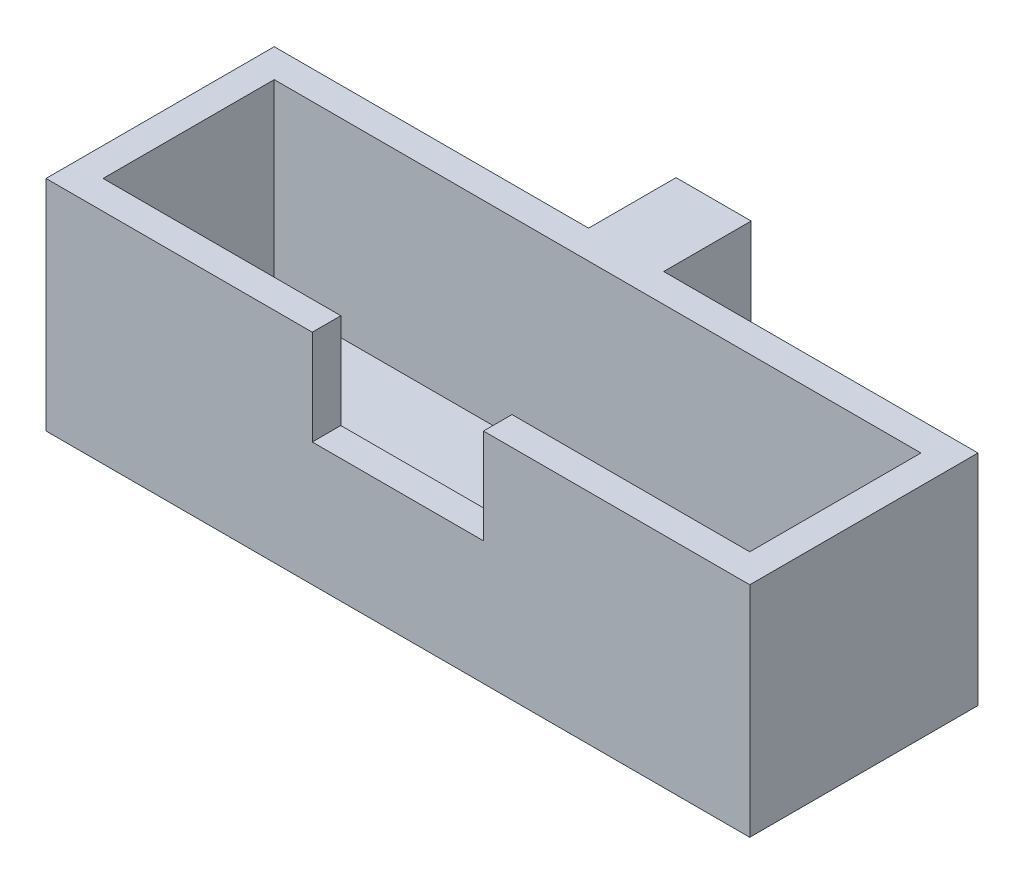
ISO-10303-21;
HEADER;
FILE_DESCRIPTION(('STEP AP214'),'2;1');
FILE_NAME('part.step','',(''),(''),'','','');
FILE_SCHEMA(('AUTOMOTIVE_DESIGN { 1 0 10303 214 1 1 1 1 }'));
ENDSEC;
DATA;
#1=APPLICATION_CONTEXT('core data for automotive mechanical design processes');
#2=APPLICATION_PROTOCOL_DEFINITION('international standard','automotive_design',2000,#1);
#3=PRODUCT_CONTEXT('',#1,'mechanical');
#4=PRODUCT('Part','Part','',(#3));
#5=PRODUCT_RELATED_PRODUCT_CATEGORY('part','',(#4));
#6=PRODUCT_DEFINITION_FORMATION('','',#4);
#7=PRODUCT_DEFINITION_CONTEXT('part definition',#1,'design');
#8=PRODUCT_DEFINITION('design','',#6,#7);
#9=PRODUCT_DEFINITION_SHAPE('','',#8);
#10=(LENGTH_UNIT() NAMED_UNIT(*) SI_UNIT(.MILLI.,.METRE.));
#11=(NAMED_UNIT(*) PLANE_ANGLE_UNIT() SI_UNIT($,.RADIAN.));
#12=(NAMED_UNIT(*) SI_UNIT($,.STERADIAN.) SOLID_ANGLE_UNIT());
#13=UNCERTAINTY_MEASURE_WITH_UNIT(LENGTH_MEASURE(1.E-05),#10,'distance_accuracy_value','');
#14=(GEOMETRIC_REPRESENTATION_CONTEXT(3) GLOBAL_UNCERTAINTY_ASSIGNED_CONTEXT((#13)) GLOBAL_UNIT_ASSIGNED_CONTEXT((#10,
#11,#12)) REPRESENTATION_CONTEXT('',''));
#15=CARTESIAN_POINT('',(0.,0.,0.));
#16=DIRECTION('',(0.,0.,1.));
#17=DIRECTION('',(1.,0.,0.));
#18=AXIS2_PLACEMENT_3D('',#15,#16,#17);
#19=CARTESIAN_POINT('',(-22.0877192982456,20.,0.336842105263163));
#20=DIRECTION('',(0.,0.,1.));
#21=DIRECTION('',(1.,0.,0.));
#22=AXIS2_PLACEMENT_3D('',#19,#20,#21);
#23=PLANE('',#22);
#24=DIRECTION('',(0.,-1.,0.));
#25=VECTOR('',#24,1.);
#26=CARTESIAN_POINT('',(18.8622807017544,0.,0.336842105263163));
#27=LINE('',#26,#25);
#28=CARTESIAN_POINT('',(18.8622807017544,20.,0.336842105263163));
#29=VERTEX_POINT('',#28);
#30=CARTESIAN_POINT('',(18.8622807017544,-3.,0.336842105263163));
#31=VERTEX_POINT('',#30);
#32=EDGE_CURVE('E62',#29,#31,#27,.T.);
#33=ORIENTED_EDGE('',*,*,#32,.F.);
#34=DIRECTION('',(-1.,0.,0.));
#35=VECTOR('',#34,1.);
#36=CARTESIAN_POINT('',(-22.0877192982456,20.,0.336842105263163));
#37=LINE('',#36,#35);
#38=CARTESIAN_POINT('',(51.9122807017544,20.,0.336842105263163));
#39=VERTEX_POINT('',#38);
#40=EDGE_CURVE('E265',#39,#29,#37,.T.);
#41=ORIENTED_EDGE('',*,*,#40,.F.);
#42=DIRECTION('',(0.,-1.,0.));
#43=VECTOR('',#42,1.);
#44=CARTESIAN_POINT('',(51.9122807017544,20.,0.336842105263163));
#45=LINE('',#44,#43);
#46=CARTESIAN_POINT('',(51.9122807017544,-3.,0.336842105263163));
#47=VERTEX_POINT('',#46);
#48=EDGE_CURVE('E269',#39,#47,#45,.T.);
#49=ORIENTED_EDGE('',*,*,#48,.T.);
#50=DIRECTION('',(1.,0.,0.));
#51=VECTOR('',#50,1.);
#52=CARTESIAN_POINT('',(0.,-3.,0.336842105263163));
#53=LINE('',#52,#51);
#54=EDGE_CURVE('E214',#31,#47,#53,.T.);
#55=ORIENTED_EDGE('',*,*,#54,.F.);
#56=EDGE_LOOP('',(#33,#41,#49,#55));
#57=FACE_BOUND('',#56,.T.);
#58=ADVANCED_FACE('F39',(#57),#23,.F.);
#59=CARTESIAN_POINT('',(0.,20.,0.));
#60=DIRECTION('',(0.,1.,0.));
#61=DIRECTION('',(0.,0.,1.));
#62=AXIS2_PLACEMENT_3D('',#59,#60,#61);
#63=PLANE('',#62);
#64=DIRECTION('',(0.,0.,-1.));
#65=VECTOR('',#64,1.);
#66=CARTESIAN_POINT('',(5.91228070175437,20.,24.3378421052632));
#67=LINE('',#66,#65);
#68=CARTESIAN_POINT('',(5.91228070175437,20.,24.3368421052632));
#69=VERTEX_POINT('',#68);
#70=CARTESIAN_POINT('',(5.91228070175437,20.,21.3368421052632));
#71=VERTEX_POINT('',#70);
#72=EDGE_CURVE('E203',#69,#71,#67,.T.);
#73=ORIENTED_EDGE('',*,*,#72,.T.);
#74=DIRECTION('',(1.,0.,0.));
#75=VECTOR('',#74,1.);
#76=CARTESIAN_POINT('',(-19.0877192982456,20.,21.3368421052632));
#77=LINE('',#76,#75);
#78=CARTESIAN_POINT('',(-19.0877192982456,20.,21.3368421052632));
#79=VERTEX_POINT('',#78);
#80=EDGE_CURVE('E229',#79,#71,#77,.T.);
#81=ORIENTED_EDGE('',*,*,#80,.F.);
#82=DIRECTION('',(0.,0.,1.));
#83=VECTOR('',#82,1.);
#84=CARTESIAN_POINT('',(-19.0877192982456,20.,3.33684210526316));
#85=LINE('',#84,#83);
#86=CARTESIAN_POINT('',(-19.0877192982456,20.,3.33684210526316));
#87=VERTEX_POINT('',#86);
#88=EDGE_CURVE('E225',#87,#79,#85,.T.);
#89=ORIENTED_EDGE('',*,*,#88,.F.);
#90=DIRECTION('',(-1.,0.,0.));
#91=VECTOR('',#90,1.);
#92=CARTESIAN_POINT('',(-19.0877192982456,20.,3.33684210526316));
#93=LINE('',#92,#91);
#94=CARTESIAN_POINT('',(48.9122807017544,20.,3.33684210526316));
#95=VERTEX_POINT('',#94);
#96=EDGE_CURVE('E235',#95,#87,#93,.T.);
#97=ORIENTED_EDGE('',*,*,#96,.F.);
#98=DIRECTION('',(0.,0.,-1.));
#99=VECTOR('',#98,1.);
#100=CARTESIAN_POINT('',(48.9122807017544,20.,3.33684210526316));
#101=LINE('',#100,#99);
#102=CARTESIAN_POINT('',(48.9122807017544,20.,21.3368421052632));
#103=VERTEX_POINT('',#102);
#104=EDGE_CURVE('E232',#103,#95,#101,.T.);
#105=ORIENTED_EDGE('',*,*,#104,.F.);
#106=CARTESIAN_POINT('',(23.9122807017544,20.,21.3368421052632));
#107=VERTEX_POINT('',#106);
#108=EDGE_CURVE('E227',#107,#103,#77,.T.);
#109=ORIENTED_EDGE('',*,*,#108,.F.);
#110=DIRECTION('',(0.,0.,-1.));
#111=VECTOR('',#110,1.);
#112=CARTESIAN_POINT('',(23.9122807017544,20.,24.3378421052632));
#113=LINE('',#112,#111);
#114=CARTESIAN_POINT('',(23.9122807017544,20.,24.3368421052632));
#115=VERTEX_POINT('',#114);
#116=EDGE_CURVE('E209',#115,#107,#113,.T.);
#117=ORIENTED_EDGE('',*,*,#116,.F.);
#118=DIRECTION('',(1.,0.,0.));
#119=VECTOR('',#118,1.);
#120=CARTESIAN_POINT('',(-22.0877192982456,20.,24.3368421052632));
#121=LINE('',#120,#119);
#122=CARTESIAN_POINT('',(51.9122807017544,20.,24.3368421052632));
#123=VERTEX_POINT('',#122);
#124=EDGE_CURVE('E259',#115,#123,#121,.T.);
#125=ORIENTED_EDGE('',*,*,#124,.T.);
#126=DIRECTION('',(0.,0.,-1.));
#127=VECTOR('',#126,1.);
#128=CARTESIAN_POINT('',(51.9122807017544,20.,0.336842105263163));
#129=LINE('',#128,#127);
#130=EDGE_CURVE('E263',#123,#39,#129,.T.);
#131=ORIENTED_EDGE('',*,*,#130,.T.);
#132=ORIENTED_EDGE('',*,*,#40,.T.);
#133=DIRECTION('',(0.,0.,1.));
#134=VECTOR('',#133,1.);
#135=CARTESIAN_POINT('',(18.8622807017544,20.,-8.86315789473684));
#136=LINE('',#135,#134);
#137=CARTESIAN_POINT('',(18.8622807017544,20.,-8.86315789473684));
#138=VERTEX_POINT('',#137);
#139=EDGE_CURVE('E161',#138,#29,#136,.T.);
#140=ORIENTED_EDGE('',*,*,#139,.F.);
#141=DIRECTION('',(1.,0.,0.));
#142=VECTOR('',#141,1.);
#143=CARTESIAN_POINT('',(0.,20.,-8.86315789473684));
#144=LINE('',#143,#142);
#145=CARTESIAN_POINT('',(10.9622807017544,20.,-8.86315789473684));
#146=VERTEX_POINT('',#145);
#147=EDGE_CURVE('E164',#146,#138,#144,.T.);
#148=ORIENTED_EDGE('',*,*,#147,.F.);
#149=DIRECTION('',(0.,0.,1.));
#150=VECTOR('',#149,1.);
#151=CARTESIAN_POINT('',(10.9622807017544,20.,-8.86315789473684));
#152=LINE('',#151,#150);
#153=CARTESIAN_POINT('',(10.9622807017544,20.,0.336842105263163));
#154=VERTEX_POINT('',#153);
#155=EDGE_CURVE('E152',#146,#154,#152,.T.);
#156=ORIENTED_EDGE('',*,*,#155,.T.);
#157=CARTESIAN_POINT('',(-22.0877192982456,20.,0.336842105263163));
#158=VERTEX_POINT('',#157);
#159=EDGE_CURVE('E54',#154,#158,#37,.T.);
#160=ORIENTED_EDGE('',*,*,#159,.T.);
#161=DIRECTION('',(0.,0.,1.));
#162=VECTOR('',#161,1.);
#163=CARTESIAN_POINT('',(-22.0877192982456,20.,0.336842105263163));
#164=LINE('',#163,#162);
#165=CARTESIAN_POINT('',(-22.0877192982456,20.,24.3368421052632));
#166=VERTEX_POINT('',#165);
#167=EDGE_CURVE('E256',#158,#166,#164,.T.);
#168=ORIENTED_EDGE('',*,*,#167,.T.);
#169=EDGE_CURVE('E260',#166,#69,#121,.T.);
#170=ORIENTED_EDGE('',*,*,#169,.T.);
#171=EDGE_LOOP('',(#73,#81,#89,#97,#105,#109,#117,#125,#131,#132,#140,#148,#156,#160,#168,#170));
#172=FACE_BOUND('',#171,.T.);
#173=ADVANCED_FACE('F166',(#172),#63,.T.);
#174=CARTESIAN_POINT('',(-22.0877192982456,20.,0.336842105263163));
#175=DIRECTION('',(1.,0.,0.));
#176=DIRECTION('',(0.,0.,-1.));
#177=AXIS2_PLACEMENT_3D('',#174,#175,#176);
#178=PLANE('',#177);
#179=DIRECTION('',(0.,-1.,0.));
#180=VECTOR('',#179,1.);
#181=CARTESIAN_POINT('',(-22.0877192982456,20.,0.336842105263163));
#182=LINE('',#181,#180);
#183=CARTESIAN_POINT('',(-22.0877192982456,-3.,0.336842105263163));
#184=VERTEX_POINT('',#183);
#185=EDGE_CURVE('E267',#158,#184,#182,.T.);
#186=ORIENTED_EDGE('',*,*,#185,.T.);
#187=DIRECTION('',(0.,0.,1.));
#188=VECTOR('',#187,1.);
#189=CARTESIAN_POINT('',(-22.0877192982456,-3.,0.));
#190=LINE('',#189,#188);
#191=CARTESIAN_POINT('',(-22.0877192982456,-3.,24.3368421052632));
#192=VERTEX_POINT('',#191);
#193=EDGE_CURVE('E218',#184,#192,#190,.T.);
#194=ORIENTED_EDGE('',*,*,#193,.T.);
#195=DIRECTION('',(0.,-1.,0.));
#196=VECTOR('',#195,1.);
#197=CARTESIAN_POINT('',(-22.0877192982456,20.,24.3368421052632));
#198=LINE('',#197,#196);
#199=EDGE_CURVE('E11',#166,#192,#198,.T.);
#200=ORIENTED_EDGE('',*,*,#199,.F.);
#201=ORIENTED_EDGE('',*,*,#167,.F.);
#202=EDGE_LOOP('',(#186,#194,#200,#201));
#203=FACE_BOUND('',#202,.T.);
#204=ADVANCED_FACE('F41',(#203),#178,.F.);
#205=CARTESIAN_POINT('',(-22.0877192982456,20.,24.3368421052632));
#206=DIRECTION('',(0.,0.,-1.));
#207=DIRECTION('',(-1.,0.,0.));
#208=AXIS2_PLACEMENT_3D('',#205,#206,#207);
#209=PLANE('',#208);
#210=DIRECTION('',(1.,0.,0.));
#211=VECTOR('',#210,1.);
#212=CARTESIAN_POINT('',(5.91228070175437,10.,24.3368421052632));
#213=LINE('',#212,#211);
#214=CARTESIAN_POINT('',(5.91228070175437,10.,24.3368421052632));
#215=VERTEX_POINT('',#214);
#216=CARTESIAN_POINT('',(23.9122807017544,10.,24.3368421052632));
#217=VERTEX_POINT('',#216);
#218=EDGE_CURVE('E189',#215,#217,#213,.T.);
#219=ORIENTED_EDGE('',*,*,#218,.F.);
#220=DIRECTION('',(0.,-1.,0.));
#221=VECTOR('',#220,1.);
#222=CARTESIAN_POINT('',(5.91228070175437,20.,24.3368421052632));
#223=LINE('',#222,#221);
#224=EDGE_CURVE('E192',#69,#215,#223,.T.);
#225=ORIENTED_EDGE('',*,*,#224,.F.);
#226=ORIENTED_EDGE('',*,*,#169,.F.);
#227=ORIENTED_EDGE('',*,*,#199,.T.);
#228=DIRECTION('',(1.,0.,0.));
#229=VECTOR('',#228,1.);
#230=CARTESIAN_POINT('',(0.,-3.,24.3368421052632));
#231=LINE('',#230,#229);
#232=CARTESIAN_POINT('',(51.9122807017544,-3.,24.3368421052632));
#233=VERTEX_POINT('',#232);
#234=EDGE_CURVE('E221',#192,#233,#231,.T.);
#235=ORIENTED_EDGE('',*,*,#234,.T.);
#236=DIRECTION('',(0.,-1.,0.));
#237=VECTOR('',#236,1.);
#238=CARTESIAN_POINT('',(51.9122807017544,20.,24.3368421052632));
#239=LINE('',#238,#237);
#240=EDGE_CURVE('E47',#123,#233,#239,.T.);
#241=ORIENTED_EDGE('',*,*,#240,.F.);
#242=ORIENTED_EDGE('',*,*,#124,.F.);
#243=DIRECTION('',(0.,1.,0.));
#244=VECTOR('',#243,1.);
#245=CARTESIAN_POINT('',(23.9122807017544,20.,24.3368421052632));
#246=LINE('',#245,#244);
#247=EDGE_CURVE('E160',#217,#115,#246,.T.);
#248=ORIENTED_EDGE('',*,*,#247,.F.);
#249=EDGE_LOOP('',(#219,#225,#226,#227,#235,#241,#242,#248));
#250=FACE_BOUND('',#249,.T.);
#251=ADVANCED_FACE('F284',(#250),#209,.F.);
#252=CARTESIAN_POINT('',(51.9122807017544,20.,0.336842105263163));
#253=DIRECTION('',(-1.,0.,0.));
#254=DIRECTION('',(0.,0.,1.));
#255=AXIS2_PLACEMENT_3D('',#252,#253,#254);
#256=PLANE('',#255);
#257=ORIENTED_EDGE('',*,*,#240,.T.);
#258=DIRECTION('',(0.,0.,1.));
#259=VECTOR('',#258,1.);
#260=CARTESIAN_POINT('',(51.9122807017544,-3.,0.));
#261=LINE('',#260,#259);
#262=EDGE_CURVE('E206',#47,#233,#261,.T.);
#263=ORIENTED_EDGE('',*,*,#262,.F.);
#264=ORIENTED_EDGE('',*,*,#48,.F.);
#265=ORIENTED_EDGE('',*,*,#130,.F.);
#266=EDGE_LOOP('',(#257,#263,#264,#265));
#267=FACE_BOUND('',#266,.T.);
#268=ADVANCED_FACE('F275',(#267),#256,.F.);
#269=ORIENTED_EDGE('',*,*,#159,.F.);
#270=DIRECTION('',(0.,-1.,0.));
#271=VECTOR('',#270,1.);
#272=CARTESIAN_POINT('',(10.9622807017544,0.,0.336842105263163));
#273=LINE('',#272,#271);
#274=CARTESIAN_POINT('',(10.9622807017544,-3.,0.336842105263163));
#275=VERTEX_POINT('',#274);
#276=EDGE_CURVE('E158',#154,#275,#273,.T.);
#277=ORIENTED_EDGE('',*,*,#276,.T.);
#278=EDGE_CURVE('E215',#184,#275,#53,.T.);
#279=ORIENTED_EDGE('',*,*,#278,.F.);
#280=ORIENTED_EDGE('',*,*,#185,.F.);
#281=EDGE_LOOP('',(#269,#277,#279,#280));
#282=FACE_BOUND('',#281,.T.);
#283=ADVANCED_FACE('F290',(#282),#23,.F.);
#284=CARTESIAN_POINT('',(-19.0877192982456,20.,3.33684210526316));
#285=DIRECTION('',(1.,0.,0.));
#286=DIRECTION('',(0.,0.,-1.));
#287=AXIS2_PLACEMENT_3D('',#284,#285,#286);
#288=PLANE('',#287);
#289=DIRECTION('',(0.,0.,1.));
#290=VECTOR('',#289,1.);
#291=CARTESIAN_POINT('',(-19.0877192982456,0.,3.33684210526316));
#292=LINE('',#291,#290);
#293=CARTESIAN_POINT('',(-19.0877192982456,0.,3.33684210526316));
#294=VERTEX_POINT('',#293);
#295=CARTESIAN_POINT('',(-19.0877192982456,0.,21.3368421052632));
#296=VERTEX_POINT('',#295);
#297=EDGE_CURVE('E224',#294,#296,#292,.T.);
#298=ORIENTED_EDGE('',*,*,#297,.F.);
#299=DIRECTION('',(0.,-1.,0.));
#300=VECTOR('',#299,1.);
#301=CARTESIAN_POINT('',(-19.0877192982456,20.,3.33684210526316));
#302=LINE('',#301,#300);
#303=EDGE_CURVE('E237',#87,#294,#302,.T.);
#304=ORIENTED_EDGE('',*,*,#303,.F.);
#305=ORIENTED_EDGE('',*,*,#88,.T.);
#306=DIRECTION('',(0.,-1.,0.));
#307=VECTOR('',#306,1.);
#308=CARTESIAN_POINT('',(-19.0877192982456,20.,21.3368421052632));
#309=LINE('',#308,#307);
#310=EDGE_CURVE('E253',#79,#296,#309,.T.);
#311=ORIENTED_EDGE('',*,*,#310,.T.);
#312=EDGE_LOOP('',(#298,#304,#305,#311));
#313=FACE_BOUND('',#312,.T.);
#314=ADVANCED_FACE('F301',(#313),#288,.T.);
#315=CARTESIAN_POINT('',(-19.0877192982456,20.,21.3368421052632));
#316=DIRECTION('',(0.,0.,-1.));
#317=DIRECTION('',(-1.,0.,0.));
#318=AXIS2_PLACEMENT_3D('',#315,#316,#317);
#319=PLANE('',#318);
#320=DIRECTION('',(0.,1.,0.));
#321=VECTOR('',#320,1.);
#322=CARTESIAN_POINT('',(5.91228070175437,20.,21.3368421052632));
#323=LINE('',#322,#321);
#324=CARTESIAN_POINT('',(5.91228070175437,10.,21.3368421052632));
#325=VERTEX_POINT('',#324);
#326=EDGE_CURVE('E195',#325,#71,#323,.T.);
#327=ORIENTED_EDGE('',*,*,#326,.F.);
#328=DIRECTION('',(-1.,0.,0.));
#329=VECTOR('',#328,1.);
#330=CARTESIAN_POINT('',(5.91228070175437,10.,21.3368421052632));
#331=LINE('',#330,#329);
#332=CARTESIAN_POINT('',(23.9122807017544,10.,21.3368421052632));
#333=VERTEX_POINT('',#332);
#334=EDGE_CURVE('E200',#333,#325,#331,.T.);
#335=ORIENTED_EDGE('',*,*,#334,.F.);
#336=DIRECTION('',(0.,-1.,0.));
#337=VECTOR('',#336,1.);
#338=CARTESIAN_POINT('',(23.9122807017544,20.,21.3368421052632));
#339=LINE('',#338,#337);
#340=EDGE_CURVE('E197',#107,#333,#339,.T.);
#341=ORIENTED_EDGE('',*,*,#340,.F.);
#342=ORIENTED_EDGE('',*,*,#108,.T.);
#343=DIRECTION('',(0.,-1.,0.));
#344=VECTOR('',#343,1.);
#345=CARTESIAN_POINT('',(48.9122807017544,20.,21.3368421052632));
#346=LINE('',#345,#344);
#347=CARTESIAN_POINT('',(48.9122807017544,0.,21.3368421052632));
#348=VERTEX_POINT('',#347);
#349=EDGE_CURVE('E251',#103,#348,#346,.T.);
#350=ORIENTED_EDGE('',*,*,#349,.T.);
#351=DIRECTION('',(1.,0.,0.));
#352=VECTOR('',#351,1.);
#353=CARTESIAN_POINT('',(-19.0877192982456,0.,21.3368421052632));
#354=LINE('',#353,#352);
#355=EDGE_CURVE('E240',#296,#348,#354,.T.);
#356=ORIENTED_EDGE('',*,*,#355,.F.);
#357=ORIENTED_EDGE('',*,*,#310,.F.);
#358=ORIENTED_EDGE('',*,*,#80,.T.);
#359=EDGE_LOOP('',(#327,#335,#341,#342,#350,#356,#357,#358));
#360=FACE_BOUND('',#359,.T.);
#361=ADVANCED_FACE('F297',(#360),#319,.T.);
#362=CARTESIAN_POINT('',(48.9122807017544,20.,3.33684210526316));
#363=DIRECTION('',(-1.,0.,0.));
#364=DIRECTION('',(0.,0.,1.));
#365=AXIS2_PLACEMENT_3D('',#362,#363,#364);
#366=PLANE('',#365);
#367=DIRECTION('',(0.,0.,-1.));
#368=VECTOR('',#367,1.);
#369=CARTESIAN_POINT('',(48.9122807017544,0.,3.33684210526316));
#370=LINE('',#369,#368);
#371=CARTESIAN_POINT('',(48.9122807017544,0.,3.33684210526316));
#372=VERTEX_POINT('',#371);
#373=EDGE_CURVE('E243',#348,#372,#370,.T.);
#374=ORIENTED_EDGE('',*,*,#373,.F.);
#375=ORIENTED_EDGE('',*,*,#349,.F.);
#376=ORIENTED_EDGE('',*,*,#104,.T.);
#377=DIRECTION('',(0.,-1.,0.));
#378=VECTOR('',#377,1.);
#379=CARTESIAN_POINT('',(48.9122807017544,20.,3.33684210526316));
#380=LINE('',#379,#378);
#381=EDGE_CURVE('E249',#95,#372,#380,.T.);
#382=ORIENTED_EDGE('',*,*,#381,.T.);
#383=EDGE_LOOP('',(#374,#375,#376,#382));
#384=FACE_BOUND('',#383,.T.);
#385=ADVANCED_FACE('F315',(#384),#366,.T.);
#386=CARTESIAN_POINT('',(-19.0877192982456,20.,3.33684210526316));
#387=DIRECTION('',(0.,0.,1.));
#388=DIRECTION('',(1.,0.,0.));
#389=AXIS2_PLACEMENT_3D('',#386,#387,#388);
#390=PLANE('',#389);
#391=DIRECTION('',(-1.,0.,0.));
#392=VECTOR('',#391,1.);
#393=CARTESIAN_POINT('',(-19.0877192982456,0.,3.33684210526316));
#394=LINE('',#393,#392);
#395=EDGE_CURVE('E228',#372,#294,#394,.T.);
#396=ORIENTED_EDGE('',*,*,#395,.F.);
#397=ORIENTED_EDGE('',*,*,#381,.F.);
#398=ORIENTED_EDGE('',*,*,#96,.T.);
#399=ORIENTED_EDGE('',*,*,#303,.T.);
#400=EDGE_LOOP('',(#396,#397,#398,#399));
#401=FACE_BOUND('',#400,.T.);
#402=ADVANCED_FACE('F308',(#401),#390,.T.);
#403=CARTESIAN_POINT('',(0.,0.,0.));
#404=DIRECTION('',(0.,1.,0.));
#405=DIRECTION('',(0.,0.,1.));
#406=AXIS2_PLACEMENT_3D('',#403,#404,#405);
#407=PLANE('',#406);
#408=ORIENTED_EDGE('',*,*,#395,.T.);
#409=ORIENTED_EDGE('',*,*,#297,.T.);
#410=ORIENTED_EDGE('',*,*,#355,.T.);
#411=ORIENTED_EDGE('',*,*,#373,.T.);
#412=EDGE_LOOP('',(#408,#409,#410,#411));
#413=FACE_BOUND('',#412,.T.);
#414=ADVANCED_FACE('F304',(#413),#407,.T.);
#415=CARTESIAN_POINT('',(0.,-3.,0.));
#416=DIRECTION('',(0.,1.,0.));
#417=DIRECTION('',(0.,0.,1.));
#418=AXIS2_PLACEMENT_3D('',#415,#416,#417);
#419=PLANE('',#418);
#420=ORIENTED_EDGE('',*,*,#262,.T.);
#421=ORIENTED_EDGE('',*,*,#234,.F.);
#422=ORIENTED_EDGE('',*,*,#193,.F.);
#423=ORIENTED_EDGE('',*,*,#278,.T.);
#424=DIRECTION('',(0.,0.,1.));
#425=VECTOR('',#424,1.);
#426=CARTESIAN_POINT('',(10.9622807017544,-3.,-8.86315789473684));
#427=LINE('',#426,#425);
#428=CARTESIAN_POINT('',(10.9622807017544,-3.,-8.86315789473684));
#429=VERTEX_POINT('',#428);
#430=EDGE_CURVE('E181',#429,#275,#427,.T.);
#431=ORIENTED_EDGE('',*,*,#430,.F.);
#432=DIRECTION('',(-1.,0.,0.));
#433=VECTOR('',#432,1.);
#434=CARTESIAN_POINT('',(0.,-3.,-8.86315789473684));
#435=LINE('',#434,#433);
#436=CARTESIAN_POINT('',(18.8622807017544,-3.,-8.86315789473684));
#437=VERTEX_POINT('',#436);
#438=EDGE_CURVE('E174',#437,#429,#435,.T.);
#439=ORIENTED_EDGE('',*,*,#438,.F.);
#440=DIRECTION('',(0.,0.,1.));
#441=VECTOR('',#440,1.);
#442=CARTESIAN_POINT('',(18.8622807017544,-3.,-8.86315789473684));
#443=LINE('',#442,#441);
#444=EDGE_CURVE('E184',#437,#31,#443,.T.);
#445=ORIENTED_EDGE('',*,*,#444,.T.);
#446=ORIENTED_EDGE('',*,*,#54,.T.);
#447=EDGE_LOOP('',(#420,#421,#422,#423,#431,#439,#445,#446));
#448=FACE_BOUND('',#447,.T.);
#449=ADVANCED_FACE('F281',(#448),#419,.F.);
#450=CARTESIAN_POINT('',(5.91228070175437,20.,24.3378421052632));
#451=DIRECTION('',(-1.,0.,0.));
#452=DIRECTION('',(0.,-1.,0.));
#453=AXIS2_PLACEMENT_3D('',#450,#451,#452);
#454=PLANE('',#453);
#455=ORIENTED_EDGE('',*,*,#224,.T.);
#456=DIRECTION('',(0.,0.,-1.));
#457=VECTOR('',#456,1.);
#458=CARTESIAN_POINT('',(5.91228070175437,10.,24.3378421052632));
#459=LINE('',#458,#457);
#460=EDGE_CURVE('E204',#215,#325,#459,.T.);
#461=ORIENTED_EDGE('',*,*,#460,.T.);
#462=ORIENTED_EDGE('',*,*,#326,.T.);
#463=ORIENTED_EDGE('',*,*,#72,.F.);
#464=EDGE_LOOP('',(#455,#461,#462,#463));
#465=FACE_BOUND('',#464,.T.);
#466=ADVANCED_FACE('F322',(#465),#454,.F.);
#467=CARTESIAN_POINT('',(5.91228070175437,10.,24.3378421052632));
#468=DIRECTION('',(0.,-1.,0.));
#469=DIRECTION('',(1.,0.,0.));
#470=AXIS2_PLACEMENT_3D('',#467,#468,#469);
#471=PLANE('',#470);
#472=ORIENTED_EDGE('',*,*,#218,.T.);
#473=DIRECTION('',(0.,0.,-1.));
#474=VECTOR('',#473,1.);
#475=CARTESIAN_POINT('',(23.9122807017544,10.,24.3378421052632));
#476=LINE('',#475,#474);
#477=EDGE_CURVE('E207',#217,#333,#476,.T.);
#478=ORIENTED_EDGE('',*,*,#477,.T.);
#479=ORIENTED_EDGE('',*,*,#334,.T.);
#480=ORIENTED_EDGE('',*,*,#460,.F.);
#481=EDGE_LOOP('',(#472,#478,#479,#480));
#482=FACE_BOUND('',#481,.T.);
#483=ADVANCED_FACE('F321',(#482),#471,.F.);
#484=CARTESIAN_POINT('',(23.9122807017544,20.,24.3378421052632));
#485=DIRECTION('',(1.,0.,0.));
#486=DIRECTION('',(0.,0.,-1.));
#487=AXIS2_PLACEMENT_3D('',#484,#485,#486);
#488=PLANE('',#487);
#489=ORIENTED_EDGE('',*,*,#247,.T.);
#490=ORIENTED_EDGE('',*,*,#116,.T.);
#491=ORIENTED_EDGE('',*,*,#340,.T.);
#492=ORIENTED_EDGE('',*,*,#477,.F.);
#493=EDGE_LOOP('',(#489,#490,#491,#492));
#494=FACE_BOUND('',#493,.T.);
#495=ADVANCED_FACE('F318',(#494),#488,.F.);
#496=CARTESIAN_POINT('',(10.9622807017544,0.,-8.86315789473684));
#497=DIRECTION('',(-1.,0.,0.));
#498=DIRECTION('',(0.,-1.,0.));
#499=AXIS2_PLACEMENT_3D('',#496,#497,#498);
#500=PLANE('',#499);
#501=ORIENTED_EDGE('',*,*,#276,.F.);
#502=ORIENTED_EDGE('',*,*,#155,.F.);
#503=DIRECTION('',(0.,-1.,0.));
#504=VECTOR('',#503,1.);
#505=CARTESIAN_POINT('',(10.9622807017544,0.,-8.86315789473684));
#506=LINE('',#505,#504);
#507=EDGE_CURVE('E157',#146,#429,#506,.T.);
#508=ORIENTED_EDGE('',*,*,#507,.T.);
#509=ORIENTED_EDGE('',*,*,#430,.T.);
#510=EDGE_LOOP('',(#501,#502,#508,#509));
#511=FACE_BOUND('',#510,.T.);
#512=ADVANCED_FACE('F154',(#511),#500,.T.);
#513=CARTESIAN_POINT('',(18.8622807017544,0.,-8.86315789473684));
#514=DIRECTION('',(-1.,0.,0.));
#515=DIRECTION('',(0.,-1.,0.));
#516=AXIS2_PLACEMENT_3D('',#513,#514,#515);
#517=PLANE('',#516);
#518=ORIENTED_EDGE('',*,*,#32,.T.);
#519=ORIENTED_EDGE('',*,*,#444,.F.);
#520=DIRECTION('',(0.,-1.,0.));
#521=VECTOR('',#520,1.);
#522=CARTESIAN_POINT('',(18.8622807017544,0.,-8.86315789473684));
#523=LINE('',#522,#521);
#524=EDGE_CURVE('E170',#138,#437,#523,.T.);
#525=ORIENTED_EDGE('',*,*,#524,.F.);
#526=ORIENTED_EDGE('',*,*,#139,.T.);
#527=EDGE_LOOP('',(#518,#519,#525,#526));
#528=FACE_BOUND('',#527,.T.);
#529=ADVANCED_FACE('F443',(#528),#517,.F.);
#530=CARTESIAN_POINT('',(0.,0.,-8.86315789473684));
#531=DIRECTION('',(0.,0.,-1.));
#532=DIRECTION('',(-1.,0.,0.));
#533=AXIS2_PLACEMENT_3D('',#530,#531,#532);
#534=PLANE('',#533);
#535=ORIENTED_EDGE('',*,*,#507,.F.);
#536=ORIENTED_EDGE('',*,*,#147,.T.);
#537=ORIENTED_EDGE('',*,*,#524,.T.);
#538=ORIENTED_EDGE('',*,*,#438,.T.);
#539=EDGE_LOOP('',(#535,#536,#537,#538));
#540=FACE_BOUND('',#539,.T.);
#541=ADVANCED_FACE('F172',(#540),#534,.T.);
#542=CLOSED_SHELL('',(#58,#173,#204,#251,#268,#283,#314,#361,#385,#402,#414,#449,#466,#483,#495,
#512,#529,#541));
#543=MANIFOLD_SOLID_BREP('B2',#542);
#544=ADVANCED_BREP_SHAPE_REPRESENTATION('',(#18,#543),#14);
#545=SHAPE_DEFINITION_REPRESENTATION(#9,#544);
ENDSEC;
END-ISO-10303-21;
